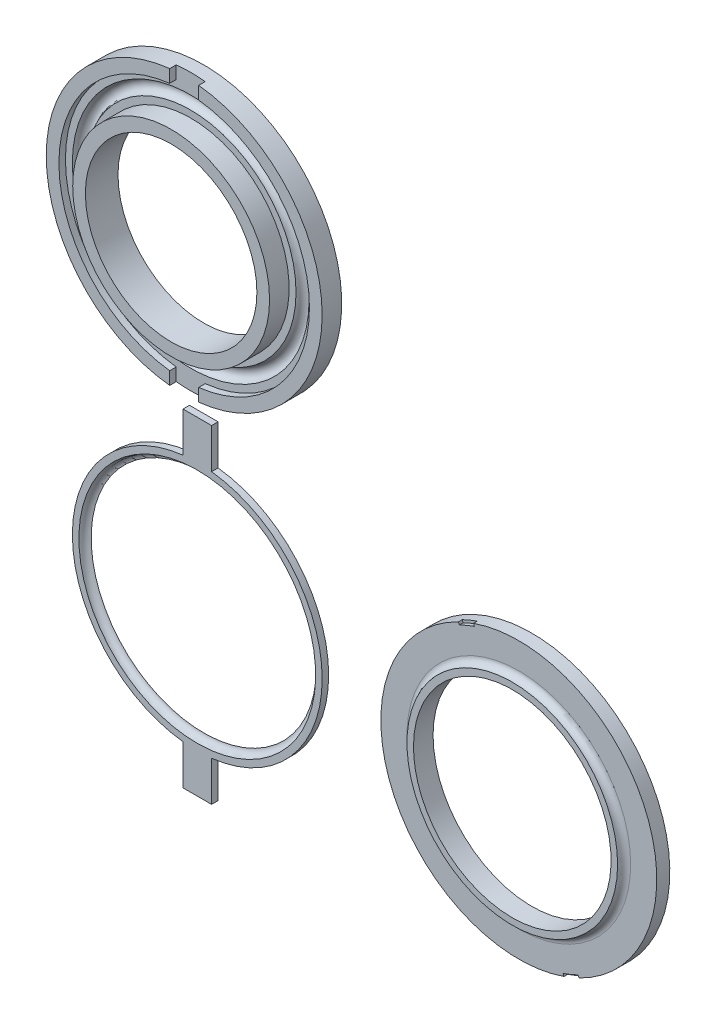
ISO-10303-21;
HEADER;
FILE_DESCRIPTION(('STEP AP214'),'2;1');
FILE_NAME('part.step','',(''),(''),'','','');
FILE_SCHEMA(('AUTOMOTIVE_DESIGN { 1 0 10303 214 1 1 1 1 }'));
ENDSEC;
DATA;
#1=APPLICATION_CONTEXT('core data for automotive mechanical design processes');
#2=APPLICATION_PROTOCOL_DEFINITION('international standard','automotive_design',2000,#1);
#3=PRODUCT_CONTEXT('',#1,'mechanical');
#4=PRODUCT('Part','Part','',(#3));
#5=PRODUCT_RELATED_PRODUCT_CATEGORY('part','',(#4));
#6=PRODUCT_DEFINITION_FORMATION('','',#4);
#7=PRODUCT_DEFINITION_CONTEXT('part definition',#1,'design');
#8=PRODUCT_DEFINITION('design','',#6,#7);
#9=PRODUCT_DEFINITION_SHAPE('','',#8);
#10=(LENGTH_UNIT() NAMED_UNIT(*) SI_UNIT(.MILLI.,.METRE.));
#11=(NAMED_UNIT(*) PLANE_ANGLE_UNIT() SI_UNIT($,.RADIAN.));
#12=(NAMED_UNIT(*) SI_UNIT($,.STERADIAN.) SOLID_ANGLE_UNIT());
#13=UNCERTAINTY_MEASURE_WITH_UNIT(LENGTH_MEASURE(1.E-05),#10,'distance_accuracy_value','');
#14=(GEOMETRIC_REPRESENTATION_CONTEXT(3) GLOBAL_UNCERTAINTY_ASSIGNED_CONTEXT((#13)) GLOBAL_UNIT_ASSIGNED_CONTEXT((#10,
#11,#12)) REPRESENTATION_CONTEXT('',''));
#15=CARTESIAN_POINT('',(0.,0.,0.));
#16=DIRECTION('',(0.,0.,1.));
#17=DIRECTION('',(1.,0.,0.));
#18=AXIS2_PLACEMENT_3D('',#15,#16,#17);
#19=CARTESIAN_POINT('',(88.,0.,-3.48853386507138));
#20=DIRECTION('',(0.,0.,1.));
#21=DIRECTION('',(0.923728021347068,0.383049008063238,0.));
#22=AXIS2_PLACEMENT_3D('',#19,#20,#21);
#23=CYLINDRICAL_SURFACE('',#22,37.);
#24=DIRECTION('',(0.,0.,1.));
#25=VECTOR('',#24,1.);
#26=CARTESIAN_POINT('',(100.112832389232,-34.9611111309463,-3.48853386507137));
#27=LINE('',#26,#25);
#28=CARTESIAN_POINT('',(100.112832389232,-34.9611111309463,1.76146613492862));
#29=VERTEX_POINT('',#28);
#30=CARTESIAN_POINT('',(100.112832389232,-34.9611111309463,0.761466134928622));
#31=VERTEX_POINT('',#30);
#32=EDGE_CURVE('E16',#29,#31,#27,.F.);
#33=ORIENTED_EDGE('',*,*,#32,.F.);
#34=CARTESIAN_POINT('',(88.,0.,1.76146613492862));
#35=DIRECTION('',(0.,0.,-1.));
#36=DIRECTION('',(-0.923728021347068,-0.383049008063238,0.));
#37=AXIS2_PLACEMENT_3D('',#34,#35,#36);
#38=CIRCLE('',#37,37.);
#39=CARTESIAN_POINT('',(71.8174875321879,33.2735073328483,1.76146613492862));
#40=VERTEX_POINT('',#39);
#41=EDGE_CURVE('E221',#29,#40,#38,.T.);
#42=ORIENTED_EDGE('',*,*,#41,.T.);
#43=DIRECTION('',(0.,0.,1.));
#44=VECTOR('',#43,1.);
#45=CARTESIAN_POINT('',(71.8174875321879,33.2735073328483,-3.48853386507137));
#46=LINE('',#45,#44);
#47=CARTESIAN_POINT('',(71.8174875321879,33.2735073328483,0.761466134928622));
#48=VERTEX_POINT('',#47);
#49=EDGE_CURVE('E189',#40,#48,#46,.F.);
#50=ORIENTED_EDGE('',*,*,#49,.T.);
#51=CARTESIAN_POINT('',(88.,0.,0.761466134928622));
#52=DIRECTION('',(0.,0.,-1.));
#53=DIRECTION('',(-0.923728021347068,-0.383049008063238,0.));
#54=AXIS2_PLACEMENT_3D('',#51,#52,#53);
#55=CIRCLE('',#54,37.);
#56=CARTESIAN_POINT('',(75.8406965293284,34.9449758779158,0.761466134928622));
#57=VERTEX_POINT('',#56);
#58=EDGE_CURVE('E186',#48,#57,#55,.T.);
#59=ORIENTED_EDGE('',*,*,#58,.T.);
#60=DIRECTION('',(0.,0.,1.));
#61=VECTOR('',#60,1.);
#62=CARTESIAN_POINT('',(75.8406965293284,34.9449758779158,-3.48853386507138));
#63=LINE('',#62,#61);
#64=CARTESIAN_POINT('',(75.8406965293284,34.9449758779158,1.76146613492862));
#65=VERTEX_POINT('',#64);
#66=EDGE_CURVE('E163',#57,#65,#63,.T.);
#67=ORIENTED_EDGE('',*,*,#66,.T.);
#68=CARTESIAN_POINT('',(104.138260095319,-33.2949930334253,1.76146613492862));
#69=VERTEX_POINT('',#68);
#70=EDGE_CURVE('E179',#65,#69,#38,.T.);
#71=ORIENTED_EDGE('',*,*,#70,.T.);
#72=DIRECTION('',(0.,0.,1.));
#73=VECTOR('',#72,1.);
#74=CARTESIAN_POINT('',(104.138260095319,-33.2949930334252,-3.48853386507138));
#75=LINE('',#74,#73);
#76=CARTESIAN_POINT('',(104.138260095319,-33.2949930334252,0.761466134928622));
#77=VERTEX_POINT('',#76);
#78=EDGE_CURVE('E105',#77,#69,#75,.T.);
#79=ORIENTED_EDGE('',*,*,#78,.F.);
#80=CARTESIAN_POINT('',(88.,0.,0.761466134928622));
#81=DIRECTION('',(0.,0.,1.));
#82=DIRECTION('',(0.923728021347068,0.383049008063238,0.));
#83=AXIS2_PLACEMENT_3D('',#80,#81,#82);
#84=CIRCLE('',#83,37.);
#85=EDGE_CURVE('E161',#31,#77,#84,.T.);
#86=ORIENTED_EDGE('',*,*,#85,.F.);
#87=EDGE_LOOP('',(#33,#42,#50,#59,#67,#71,#79,#86));
#88=FACE_BOUND('',#87,.T.);
#89=CARTESIAN_POINT('',(88.,0.,-1.73853386507138));
#90=DIRECTION('',(0.,0.,-1.));
#91=DIRECTION('',(-1.,0.,0.));
#92=AXIS2_PLACEMENT_3D('',#89,#90,#91);
#93=CIRCLE('',#92,37.);
#94=CARTESIAN_POINT('',(51.,0.,-1.73853386507138));
#95=VERTEX_POINT('',#94);
#96=EDGE_CURVE('E246',#95,#95,#93,.T.);
#97=ORIENTED_EDGE('',*,*,#96,.F.);
#98=EDGE_LOOP('',(#97));
#99=FACE_BOUND('',#98,.T.);
#100=ADVANCED_FACE('F95',(#88,#99),#23,.T.);
#101=CARTESIAN_POINT('',(88.,0.,0.011466134928624));
#102=DIRECTION('',(0.,0.,1.));
#103=DIRECTION('',(0.923728021347068,0.383049008063238,0.));
#104=AXIS2_PLACEMENT_3D('',#101,#102,#103);
#105=CYLINDRICAL_SURFACE('',#104,26.5);
#106=CARTESIAN_POINT('',(88.,0.,3.51146613492862));
#107=DIRECTION('',(0.,0.,-1.));
#108=DIRECTION('',(-0.923728021347068,-0.383049008063238,0.));
#109=AXIS2_PLACEMENT_3D('',#106,#107,#108);
#110=CIRCLE('',#109,26.5);
#111=CARTESIAN_POINT('',(63.5212074343027,-10.1507987136758,3.51146613492862));
#112=VERTEX_POINT('',#111);
#113=EDGE_CURVE('E213',#112,#112,#110,.T.);
#114=ORIENTED_EDGE('',*,*,#113,.F.);
#115=EDGE_LOOP('',(#114));
#116=FACE_BOUND('',#115,.T.);
#117=CARTESIAN_POINT('',(88.,0.,-1.73853386507138));
#118=DIRECTION('',(0.,0.,-1.));
#119=DIRECTION('',(-1.,0.,0.));
#120=AXIS2_PLACEMENT_3D('',#117,#118,#119);
#121=CIRCLE('',#120,26.5);
#122=CARTESIAN_POINT('',(61.5,0.,-1.73853386507138));
#123=VERTEX_POINT('',#122);
#124=EDGE_CURVE('E99',#123,#123,#121,.T.);
#125=ORIENTED_EDGE('',*,*,#124,.T.);
#126=EDGE_LOOP('',(#125));
#127=FACE_BOUND('',#126,.T.);
#128=ADVANCED_FACE('F253',(#116,#127),#105,.F.);
#129=CARTESIAN_POINT('',(88.,0.,3.51146613492862));
#130=DIRECTION('',(0.,0.,-1.));
#131=DIRECTION('',(-0.923728021347068,-0.383049008063238,0.));
#132=AXIS2_PLACEMENT_3D('',#129,#130,#131);
#133=TOROIDAL_SURFACE('',#132,30.,1.75);
#134=CARTESIAN_POINT('',(60.288159359588,-11.4914702418971,3.51146613492862));
#135=DIRECTION('',(-0.383049008063238,0.923728021347068,0.));
#136=DIRECTION('',(0.923728021347068,0.383049008063238,0.));
#137=AXIS2_PLACEMENT_3D('',#134,#135,#136);
#138=CIRCLE('',#137,1.75);
#139=CARTESIAN_POINT('',(61.9046833969453,-10.8211344777865,3.51146613492862));
#140=VERTEX_POINT('',#139);
#141=CARTESIAN_POINT('',(60.288159359588,-11.4914702418971,1.76146613492862));
#142=VERTEX_POINT('',#141);
#143=EDGE_CURVE('E208',#140,#142,#138,.T.);
#144=ORIENTED_EDGE('',*,*,#143,.T.);
#145=CARTESIAN_POINT('',(88.,0.,1.76146613492862));
#146=DIRECTION('',(0.,0.,-1.));
#147=DIRECTION('',(-0.923728021347068,-0.383049008063238,0.));
#148=AXIS2_PLACEMENT_3D('',#145,#146,#147);
#149=CIRCLE('',#148,30.);
#150=EDGE_CURVE('E195',#142,#142,#149,.F.);
#151=ORIENTED_EDGE('',*,*,#150,.T.);
#152=ORIENTED_EDGE('',*,*,#143,.F.);
#153=CARTESIAN_POINT('',(88.,0.,3.51146613492862));
#154=DIRECTION('',(0.,0.,1.));
#155=DIRECTION('',(0.923728021347068,0.383049008063238,0.));
#156=AXIS2_PLACEMENT_3D('',#153,#154,#155);
#157=CIRCLE('',#156,28.25);
#158=EDGE_CURVE('E216',#140,#140,#157,.T.);
#159=ORIENTED_EDGE('',*,*,#158,.F.);
#160=EDGE_LOOP('',(#144,#151,#152,#159));
#161=FACE_BOUND('',#160,.T.);
#162=ADVANCED_FACE('F268',(#161),#133,.F.);
#163=CARTESIAN_POINT('',(88.,0.,3.51146613492862));
#164=DIRECTION('',(0.,0.,-1.));
#165=DIRECTION('',(-0.923728021347068,-0.383049008063238,0.));
#166=AXIS2_PLACEMENT_3D('',#163,#164,#165);
#167=PLANE('',#166);
#168=ORIENTED_EDGE('',*,*,#113,.T.);
#169=EDGE_LOOP('',(#168));
#170=FACE_BOUND('',#169,.T.);
#171=ORIENTED_EDGE('',*,*,#158,.T.);
#172=EDGE_LOOP('',(#171));
#173=FACE_BOUND('',#172,.T.);
#174=ADVANCED_FACE('F275',(#170,#173),#167,.F.);
#175=CARTESIAN_POINT('',(105.330974134264,-36.1712395607262,0.011466134928624));
#176=DIRECTION('',(0.923728021347068,0.383049008063238,0.));
#177=DIRECTION('',(0.,0.,-1.));
#178=AXIS2_PLACEMENT_3D('',#175,#176,#177);
#179=PLANE('',#178);
#180=DIRECTION('',(-0.383049008063238,0.923728021347068,0.));
#181=VECTOR('',#180,1.);
#182=CARTESIAN_POINT('',(105.330974134264,-36.1712395607262,0.761466134928622));
#183=LINE('',#182,#181);
#184=CARTESIAN_POINT('',(76.0901088586741,34.3435145697375,0.761466134928622));
#185=VERTEX_POINT('',#184);
#186=EDGE_CURVE('E190',#185,#57,#183,.T.);
#187=ORIENTED_EDGE('',*,*,#186,.F.);
#188=DIRECTION('',(0.,0.,1.));
#189=VECTOR('',#188,1.);
#190=CARTESIAN_POINT('',(76.0901088586741,34.3435145697375,-3.48853386507138));
#191=LINE('',#190,#189);
#192=CARTESIAN_POINT('',(76.0901088586741,34.3435145697375,1.76146613492862));
#193=VERTEX_POINT('',#192);
#194=EDGE_CURVE('E192',#193,#185,#191,.F.);
#195=ORIENTED_EDGE('',*,*,#194,.F.);
#196=DIRECTION('',(-0.383049008063238,0.923728021347068,0.));
#197=VECTOR('',#196,1.);
#198=CARTESIAN_POINT('',(105.330974134264,-36.1712395607262,1.76146613492862));
#199=LINE('',#198,#197);
#200=EDGE_CURVE('E234',#193,#65,#199,.T.);
#201=ORIENTED_EDGE('',*,*,#200,.T.);
#202=ORIENTED_EDGE('',*,*,#66,.F.);
#203=EDGE_LOOP('',(#187,#195,#201,#202));
#204=FACE_BOUND('',#203,.T.);
#205=ADVANCED_FACE('F279',(#204),#179,.F.);
#206=CARTESIAN_POINT('',(105.330974134264,-36.1712395607262,0.761466134928622));
#207=DIRECTION('',(0.,0.,-1.));
#208=DIRECTION('',(-0.923728021347068,-0.383049008063238,0.));
#209=AXIS2_PLACEMENT_3D('',#206,#207,#208);
#210=PLANE('',#209);
#211=DIRECTION('',(-0.383049008063238,0.923728021347068,0.));
#212=VECTOR('',#211,1.);
#213=CARTESIAN_POINT('',(101.306655782651,-37.8400328820205,0.761466134928622));
#214=LINE('',#213,#212);
#215=CARTESIAN_POINT('',(72.0669197695567,32.6719980161951,0.761466134928622));
#216=VERTEX_POINT('',#215);
#217=EDGE_CURVE('E184',#216,#48,#214,.T.);
#218=ORIENTED_EDGE('',*,*,#217,.F.);
#219=CARTESIAN_POINT('',(88.,0.,0.761466134928622));
#220=DIRECTION('',(0.,0.,-1.));
#221=DIRECTION('',(-0.923728021347068,-0.383049008063238,0.));
#222=AXIS2_PLACEMENT_3D('',#219,#220,#221);
#223=CIRCLE('',#222,36.35);
#224=EDGE_CURVE('E154',#185,#216,#223,.F.);
#225=ORIENTED_EDGE('',*,*,#224,.F.);
#226=ORIENTED_EDGE('',*,*,#186,.T.);
#227=ORIENTED_EDGE('',*,*,#58,.F.);
#228=EDGE_LOOP('',(#218,#225,#226,#227));
#229=FACE_BOUND('',#228,.T.);
#230=ADVANCED_FACE('F281',(#229),#210,.F.);
#231=CARTESIAN_POINT('',(101.306655782651,-37.8400328820205,0.011466134928624));
#232=DIRECTION('',(-0.923728021347068,-0.383049008063238,0.));
#233=DIRECTION('',(0.,0.,1.));
#234=AXIS2_PLACEMENT_3D('',#231,#232,#233);
#235=PLANE('',#234);
#236=ORIENTED_EDGE('',*,*,#49,.F.);
#237=DIRECTION('',(-0.383049008063238,0.923728021347068,0.));
#238=VECTOR('',#237,1.);
#239=CARTESIAN_POINT('',(101.306655782651,-37.8400328820205,1.76146613492862));
#240=LINE('',#239,#238);
#241=CARTESIAN_POINT('',(72.0669197695567,32.6719980161951,1.76146613492862));
#242=VERTEX_POINT('',#241);
#243=EDGE_CURVE('E224',#242,#40,#240,.T.);
#244=ORIENTED_EDGE('',*,*,#243,.F.);
#245=DIRECTION('',(0.,0.,1.));
#246=VECTOR('',#245,1.);
#247=CARTESIAN_POINT('',(72.0669197695567,32.6719980161951,-3.48853386507137));
#248=LINE('',#247,#246);
#249=EDGE_CURVE('E160',#216,#242,#248,.T.);
#250=ORIENTED_EDGE('',*,*,#249,.F.);
#251=ORIENTED_EDGE('',*,*,#217,.T.);
#252=EDGE_LOOP('',(#236,#244,#250,#251));
#253=FACE_BOUND('',#252,.T.);
#254=ADVANCED_FACE('F223',(#253),#235,.F.);
#255=CARTESIAN_POINT('',(88.,0.,-3.48853386507138));
#256=DIRECTION('',(0.,0.,1.));
#257=DIRECTION('',(0.923728021347068,0.383049008063238,0.));
#258=AXIS2_PLACEMENT_3D('',#255,#256,#257);
#259=CYLINDRICAL_SURFACE('',#258,36.35);
#260=ORIENTED_EDGE('',*,*,#249,.T.);
#261=CARTESIAN_POINT('',(88.,0.,1.76146613492862));
#262=DIRECTION('',(0.,0.,1.));
#263=DIRECTION('',(0.923728021347068,0.383049008063238,0.));
#264=AXIS2_PLACEMENT_3D('',#261,#262,#263);
#265=CIRCLE('',#264,36.35);
#266=EDGE_CURVE('E232',#242,#193,#265,.F.);
#267=ORIENTED_EDGE('',*,*,#266,.T.);
#268=ORIENTED_EDGE('',*,*,#194,.T.);
#269=ORIENTED_EDGE('',*,*,#224,.T.);
#270=EDGE_LOOP('',(#260,#267,#268,#269));
#271=FACE_BOUND('',#270,.T.);
#272=ADVANCED_FACE('F287',(#271),#259,.T.);
#273=CARTESIAN_POINT('',(71.2939999028797,34.5359050465652,0.011466134928624));
#274=DIRECTION('',(0.923728021347068,0.383049008063238,0.));
#275=DIRECTION('',(0.,0.,-1.));
#276=AXIS2_PLACEMENT_3D('',#273,#274,#275);
#277=PLANE('',#276);
#278=ORIENTED_EDGE('',*,*,#32,.T.);
#279=DIRECTION('',(0.383049008063238,-0.923728021347068,0.));
#280=VECTOR('',#279,1.);
#281=CARTESIAN_POINT('',(71.2939999028797,34.5359050465652,0.761466134928622));
#282=LINE('',#281,#280);
#283=CARTESIAN_POINT('',(99.863400151863,-34.3596018142931,0.761466134928622));
#284=VERTEX_POINT('',#283);
#285=EDGE_CURVE('E114',#284,#31,#282,.T.);
#286=ORIENTED_EDGE('',*,*,#285,.F.);
#287=DIRECTION('',(0.,0.,1.));
#288=VECTOR('',#287,1.);
#289=CARTESIAN_POINT('',(99.863400151863,-34.3596018142931,-3.48853386507137));
#290=LINE('',#289,#288);
#291=CARTESIAN_POINT('',(99.863400151863,-34.3596018142931,1.76146613492862));
#292=VERTEX_POINT('',#291);
#293=EDGE_CURVE('E196',#284,#292,#290,.T.);
#294=ORIENTED_EDGE('',*,*,#293,.T.);
#295=DIRECTION('',(0.383049008063238,-0.923728021347068,0.));
#296=VECTOR('',#295,1.);
#297=CARTESIAN_POINT('',(71.2939999028797,34.5359050465652,1.76146613492862));
#298=LINE('',#297,#296);
#299=EDGE_CURVE('E244',#292,#29,#298,.T.);
#300=ORIENTED_EDGE('',*,*,#299,.T.);
#301=EDGE_LOOP('',(#278,#286,#294,#300));
#302=FACE_BOUND('',#301,.T.);
#303=ADVANCED_FACE('F301',(#302),#277,.T.);
#304=CARTESIAN_POINT('',(75.3183182544936,36.2046983678594,0.011466134928624));
#305=DIRECTION('',(-0.923728021347068,-0.383049008063238,0.));
#306=DIRECTION('',(0.,0.,1.));
#307=AXIS2_PLACEMENT_3D('',#304,#305,#306);
#308=PLANE('',#307);
#309=ORIENTED_EDGE('',*,*,#78,.T.);
#310=DIRECTION('',(0.383049008063238,-0.923728021347068,0.));
#311=VECTOR('',#310,1.);
#312=CARTESIAN_POINT('',(75.3183182544936,36.2046983678594,1.76146613492862));
#313=LINE('',#312,#311);
#314=CARTESIAN_POINT('',(103.888847765973,-32.6935317252469,1.76146613492862));
#315=VERTEX_POINT('',#314);
#316=EDGE_CURVE('E239',#315,#69,#313,.T.);
#317=ORIENTED_EDGE('',*,*,#316,.F.);
#318=DIRECTION('',(0.,0.,1.));
#319=VECTOR('',#318,1.);
#320=CARTESIAN_POINT('',(103.888847765973,-32.6935317252469,-3.48853386507138));
#321=LINE('',#320,#319);
#322=CARTESIAN_POINT('',(103.888847765973,-32.6935317252469,0.761466134928622));
#323=VERTEX_POINT('',#322);
#324=EDGE_CURVE('E173',#315,#323,#321,.F.);
#325=ORIENTED_EDGE('',*,*,#324,.T.);
#326=DIRECTION('',(0.383049008063238,-0.923728021347068,0.));
#327=VECTOR('',#326,1.);
#328=CARTESIAN_POINT('',(75.3183182544936,36.2046983678594,0.761466134928622));
#329=LINE('',#328,#327);
#330=EDGE_CURVE('E127',#323,#77,#329,.T.);
#331=ORIENTED_EDGE('',*,*,#330,.T.);
#332=EDGE_LOOP('',(#309,#317,#325,#331));
#333=FACE_BOUND('',#332,.T.);
#334=ADVANCED_FACE('F168',(#333),#308,.T.);
#335=CARTESIAN_POINT('',(75.3183182544936,36.2046983678594,0.761466134928622));
#336=DIRECTION('',(0.,0.,1.));
#337=DIRECTION('',(0.923728021347068,0.383049008063238,0.));
#338=AXIS2_PLACEMENT_3D('',#335,#336,#337);
#339=PLANE('',#338);
#340=ORIENTED_EDGE('',*,*,#85,.T.);
#341=ORIENTED_EDGE('',*,*,#330,.F.);
#342=CARTESIAN_POINT('',(88.,0.,0.761466134928622));
#343=DIRECTION('',(0.,0.,1.));
#344=DIRECTION('',(0.923728021347068,0.383049008063238,0.));
#345=AXIS2_PLACEMENT_3D('',#342,#343,#344);
#346=CIRCLE('',#345,36.35);
#347=EDGE_CURVE('E174',#323,#284,#346,.F.);
#348=ORIENTED_EDGE('',*,*,#347,.T.);
#349=ORIENTED_EDGE('',*,*,#285,.T.);
#350=EDGE_LOOP('',(#340,#341,#348,#349));
#351=FACE_BOUND('',#350,.T.);
#352=ADVANCED_FACE('F97',(#351),#339,.T.);
#353=CARTESIAN_POINT('',(88.,0.,-3.48853386507138));
#354=DIRECTION('',(0.,0.,1.));
#355=DIRECTION('',(0.923728021347068,0.383049008063238,0.));
#356=AXIS2_PLACEMENT_3D('',#353,#354,#355);
#357=CYLINDRICAL_SURFACE('',#356,36.35);
#358=ORIENTED_EDGE('',*,*,#347,.F.);
#359=ORIENTED_EDGE('',*,*,#324,.F.);
#360=CARTESIAN_POINT('',(88.,0.,1.76146613492862));
#361=DIRECTION('',(0.,0.,-1.));
#362=DIRECTION('',(-0.923728021347068,-0.383049008063238,0.));
#363=AXIS2_PLACEMENT_3D('',#360,#361,#362);
#364=CIRCLE('',#363,36.35);
#365=EDGE_CURVE('E241',#292,#315,#364,.F.);
#366=ORIENTED_EDGE('',*,*,#365,.F.);
#367=ORIENTED_EDGE('',*,*,#293,.F.);
#368=EDGE_LOOP('',(#358,#359,#366,#367));
#369=FACE_BOUND('',#368,.T.);
#370=ADVANCED_FACE('F261',(#369),#357,.T.);
#371=CARTESIAN_POINT('',(88.,0.,1.76146613492862));
#372=DIRECTION('',(0.,0.,-1.));
#373=DIRECTION('',(-0.923728021347068,-0.383049008063238,0.));
#374=AXIS2_PLACEMENT_3D('',#371,#372,#373);
#375=PLANE('',#374);
#376=ORIENTED_EDGE('',*,*,#299,.F.);
#377=ORIENTED_EDGE('',*,*,#365,.T.);
#378=ORIENTED_EDGE('',*,*,#316,.T.);
#379=ORIENTED_EDGE('',*,*,#70,.F.);
#380=ORIENTED_EDGE('',*,*,#200,.F.);
#381=ORIENTED_EDGE('',*,*,#266,.F.);
#382=ORIENTED_EDGE('',*,*,#243,.T.);
#383=ORIENTED_EDGE('',*,*,#41,.F.);
#384=EDGE_LOOP('',(#376,#377,#378,#379,#380,#381,#382,#383));
#385=FACE_BOUND('',#384,.T.);
#386=ORIENTED_EDGE('',*,*,#150,.F.);
#387=EDGE_LOOP('',(#386));
#388=FACE_BOUND('',#387,.T.);
#389=ADVANCED_FACE('F228',(#385,#388),#375,.F.);
#390=CARTESIAN_POINT('',(88.,0.,-1.73853386507138));
#391=DIRECTION('',(0.,0.,-1.));
#392=DIRECTION('',(-1.,0.,0.));
#393=AXIS2_PLACEMENT_3D('',#390,#391,#392);
#394=PLANE('',#393);
#395=ORIENTED_EDGE('',*,*,#124,.F.);
#396=EDGE_LOOP('',(#395));
#397=FACE_BOUND('',#396,.T.);
#398=ORIENTED_EDGE('',*,*,#96,.T.);
#399=EDGE_LOOP('',(#398));
#400=FACE_BOUND('',#399,.T.);
#401=ADVANCED_FACE('F255',(#397,#400),#394,.T.);
#402=CLOSED_SHELL('',(#100,#128,#162,#174,#205,#230,#254,#272,#303,#334,#352,#370,#389,#401));
#403=MANIFOLD_SOLID_BREP('B2',#402);
#404=CARTESIAN_POINT('',(0.,88.,3.51146613492862));
#405=DIRECTION('',(0.,0.,-1.));
#406=DIRECTION('',(-1.,0.,0.));
#407=AXIS2_PLACEMENT_3D('',#404,#405,#406);
#408=CYLINDRICAL_SURFACE('',#407,33.6);
#409=CARTESIAN_POINT('',(0.,88.,3.51146613492862));
#410=DIRECTION('',(0.,0.,1.));
#411=DIRECTION('',(1.,0.,0.));
#412=AXIS2_PLACEMENT_3D('',#409,#410,#411);
#413=CIRCLE('',#412,33.6);
#414=CARTESIAN_POINT('',(-3.885,121.374642694717,3.51146613492862));
#415=VERTEX_POINT('',#414);
#416=CARTESIAN_POINT('',(-3.885,54.6253573052834,3.51146613492862));
#417=VERTEX_POINT('',#416);
#418=EDGE_CURVE('E799',#415,#417,#413,.T.);
#419=ORIENTED_EDGE('',*,*,#418,.T.);
#420=DIRECTION('',(0.,0.,1.));
#421=VECTOR('',#420,1.);
#422=CARTESIAN_POINT('',(-3.885,54.6253573052834,-6.81268779365067));
#423=LINE('',#422,#421);
#424=CARTESIAN_POINT('',(-3.885,54.6253573052834,1.76146613492862));
#425=VERTEX_POINT('',#424);
#426=EDGE_CURVE('E458',#425,#417,#423,.T.);
#427=ORIENTED_EDGE('',*,*,#426,.F.);
#428=CARTESIAN_POINT('',(0.,88.,1.76146613492862));
#429=DIRECTION('',(0.,0.,1.));
#430=DIRECTION('',(1.,0.,0.));
#431=AXIS2_PLACEMENT_3D('',#428,#429,#430);
#432=CIRCLE('',#431,33.6);
#433=CARTESIAN_POINT('',(-3.885,121.374642694717,1.76146613492862));
#434=VERTEX_POINT('',#433);
#435=EDGE_CURVE('E534',#434,#425,#432,.T.);
#436=ORIENTED_EDGE('',*,*,#435,.F.);
#437=DIRECTION('',(0.,0.,1.));
#438=VECTOR('',#437,1.);
#439=CARTESIAN_POINT('',(-3.885,121.374642694717,-6.81268779365067));
#440=LINE('',#439,#438);
#441=EDGE_CURVE('E818',#434,#415,#440,.T.);
#442=ORIENTED_EDGE('',*,*,#441,.T.);
#443=EDGE_LOOP('',(#419,#427,#436,#442));
#444=FACE_BOUND('',#443,.T.);
#445=ADVANCED_FACE('F434',(#444),#408,.F.);
#446=CARTESIAN_POINT('',(0.,88.,3.51146613492862));
#447=DIRECTION('',(0.,0.,1.));
#448=DIRECTION('',(1.,0.,0.));
#449=AXIS2_PLACEMENT_3D('',#446,#447,#448);
#450=PLANE('',#449);
#451=CARTESIAN_POINT('',(0.,88.,3.51146613492862));
#452=DIRECTION('',(0.,0.,1.));
#453=DIRECTION('',(1.,0.,0.));
#454=AXIS2_PLACEMENT_3D('',#451,#452,#453);
#455=CIRCLE('',#454,37.);
#456=CARTESIAN_POINT('',(-3.885,124.795472207868,3.51146613492862));
#457=VERTEX_POINT('',#456);
#458=CARTESIAN_POINT('',(-3.885,51.2045277921318,3.51146613492862));
#459=VERTEX_POINT('',#458);
#460=EDGE_CURVE('E551',#457,#459,#455,.T.);
#461=ORIENTED_EDGE('',*,*,#460,.T.);
#462=DIRECTION('',(0.,1.,0.));
#463=VECTOR('',#462,1.);
#464=CARTESIAN_POINT('',(-3.885,0.,3.51146613492862));
#465=LINE('',#464,#463);
#466=EDGE_CURVE('E837',#459,#417,#465,.T.);
#467=ORIENTED_EDGE('',*,*,#466,.T.);
#468=ORIENTED_EDGE('',*,*,#418,.F.);
#469=DIRECTION('',(0.,1.,0.));
#470=VECTOR('',#469,1.);
#471=CARTESIAN_POINT('',(-3.885,0.,3.51146613492862));
#472=LINE('',#471,#470);
#473=EDGE_CURVE('E821',#415,#457,#472,.T.);
#474=ORIENTED_EDGE('',*,*,#473,.T.);
#475=EDGE_LOOP('',(#461,#467,#468,#474));
#476=FACE_BOUND('',#475,.T.);
#477=ADVANCED_FACE('F590',(#476),#450,.T.);
#478=CARTESIAN_POINT('',(0.,88.,3.51146613492862));
#479=DIRECTION('',(0.,0.,-1.));
#480=DIRECTION('',(-1.,0.,0.));
#481=AXIS2_PLACEMENT_3D('',#478,#479,#480);
#482=CYLINDRICAL_SURFACE('',#481,23.);
#483=CARTESIAN_POINT('',(0.,88.,7.01146613492863));
#484=DIRECTION('',(0.,0.,1.));
#485=DIRECTION('',(1.,0.,0.));
#486=AXIS2_PLACEMENT_3D('',#483,#484,#485);
#487=CIRCLE('',#486,23.);
#488=CARTESIAN_POINT('',(23.,88.,7.01146613492863));
#489=VERTEX_POINT('',#488);
#490=EDGE_CURVE('E443',#489,#489,#487,.T.);
#491=ORIENTED_EDGE('',*,*,#490,.T.);
#492=EDGE_LOOP('',(#491));
#493=FACE_BOUND('',#492,.T.);
#494=CARTESIAN_POINT('',(0.,88.,-1.73853386507138));
#495=DIRECTION('',(0.,0.,-1.));
#496=DIRECTION('',(-1.,0.,0.));
#497=AXIS2_PLACEMENT_3D('',#494,#495,#496);
#498=CIRCLE('',#497,23.);
#499=CARTESIAN_POINT('',(-23.,88.,-1.73853386507138));
#500=VERTEX_POINT('',#499);
#501=EDGE_CURVE('E562',#500,#500,#498,.T.);
#502=ORIENTED_EDGE('',*,*,#501,.T.);
#503=EDGE_LOOP('',(#502));
#504=FACE_BOUND('',#503,.T.);
#505=ADVANCED_FACE('F436',(#493,#504),#482,.F.);
#506=CARTESIAN_POINT('',(0.,88.,3.51146613492862));
#507=DIRECTION('',(0.,0.,-1.));
#508=DIRECTION('',(-1.,0.,0.));
#509=AXIS2_PLACEMENT_3D('',#506,#507,#508);
#510=CYLINDRICAL_SURFACE('',#509,26.4);
#511=CARTESIAN_POINT('',(0.,88.,1.76146613492862));
#512=DIRECTION('',(0.,0.,-1.));
#513=DIRECTION('',(-1.,0.,0.));
#514=AXIS2_PLACEMENT_3D('',#511,#512,#513);
#515=CIRCLE('',#514,26.4);
#516=CARTESIAN_POINT('',(-26.4,88.,1.76146613492862));
#517=VERTEX_POINT('',#516);
#518=EDGE_CURVE('E566',#517,#517,#515,.T.);
#519=ORIENTED_EDGE('',*,*,#518,.F.);
#520=EDGE_LOOP('',(#519));
#521=FACE_BOUND('',#520,.T.);
#522=CARTESIAN_POINT('',(0.,88.,7.01146613492863));
#523=DIRECTION('',(0.,0.,1.));
#524=DIRECTION('',(1.,0.,0.));
#525=AXIS2_PLACEMENT_3D('',#522,#523,#524);
#526=CIRCLE('',#525,26.4);
#527=CARTESIAN_POINT('',(26.4,88.,7.01146613492863));
#528=VERTEX_POINT('',#527);
#529=EDGE_CURVE('E93',#528,#528,#526,.T.);
#530=ORIENTED_EDGE('',*,*,#529,.F.);
#531=EDGE_LOOP('',(#530));
#532=FACE_BOUND('',#531,.T.);
#533=ADVANCED_FACE('F578',(#521,#532),#510,.T.);
#534=CARTESIAN_POINT('',(0.,88.,7.01146613492863));
#535=DIRECTION('',(0.,0.,1.));
#536=DIRECTION('',(1.,0.,0.));
#537=AXIS2_PLACEMENT_3D('',#534,#535,#536);
#538=PLANE('',#537);
#539=ORIENTED_EDGE('',*,*,#529,.T.);
#540=EDGE_LOOP('',(#539));
#541=FACE_BOUND('',#540,.T.);
#542=ORIENTED_EDGE('',*,*,#490,.F.);
#543=EDGE_LOOP('',(#542));
#544=FACE_BOUND('',#543,.T.);
#545=ADVANCED_FACE('F575',(#541,#544),#538,.T.);
#546=CARTESIAN_POINT('',(0.,88.,-1.73853386507138));
#547=DIRECTION('',(0.,0.,-1.));
#548=DIRECTION('',(-1.,0.,0.));
#549=AXIS2_PLACEMENT_3D('',#546,#547,#548);
#550=PLANE('',#549);
#551=ORIENTED_EDGE('',*,*,#501,.F.);
#552=EDGE_LOOP('',(#551));
#553=FACE_BOUND('',#552,.T.);
#554=CARTESIAN_POINT('',(0.,88.,-1.73853386507138));
#555=DIRECTION('',(0.,0.,-1.));
#556=DIRECTION('',(-1.,0.,0.));
#557=AXIS2_PLACEMENT_3D('',#554,#555,#556);
#558=CIRCLE('',#557,37.);
#559=CARTESIAN_POINT('',(-37.,88.,-1.73853386507138));
#560=VERTEX_POINT('',#559);
#561=EDGE_CURVE('E546',#560,#560,#558,.T.);
#562=ORIENTED_EDGE('',*,*,#561,.T.);
#563=EDGE_LOOP('',(#562));
#564=FACE_BOUND('',#563,.T.);
#565=ADVANCED_FACE('F577',(#553,#564),#550,.T.);
#566=CARTESIAN_POINT('',(0.,88.,1.76146613492862));
#567=DIRECTION('',(0.,0.,-1.));
#568=DIRECTION('',(-1.,0.,0.));
#569=AXIS2_PLACEMENT_3D('',#566,#567,#568);
#570=PLANE('',#569);
#571=ORIENTED_EDGE('',*,*,#518,.T.);
#572=EDGE_LOOP('',(#571));
#573=FACE_BOUND('',#572,.T.);
#574=CARTESIAN_POINT('',(0.,88.,1.76146613492862));
#575=DIRECTION('',(0.,0.,1.));
#576=DIRECTION('',(1.,0.,0.));
#577=AXIS2_PLACEMENT_3D('',#574,#575,#576);
#578=CIRCLE('',#577,28.25);
#579=CARTESIAN_POINT('',(28.25,88.,1.76146613492862));
#580=VERTEX_POINT('',#579);
#581=EDGE_CURVE('E554',#580,#580,#578,.T.);
#582=ORIENTED_EDGE('',*,*,#581,.T.);
#583=EDGE_LOOP('',(#582));
#584=FACE_BOUND('',#583,.T.);
#585=ADVANCED_FACE('F585',(#573,#584),#570,.F.);
#586=CARTESIAN_POINT('',(3.885,54.6253573052834,1.76146613492862));
#587=VERTEX_POINT('',#586);
#588=CARTESIAN_POINT('',(3.885,121.374642694717,1.76146613492862));
#589=VERTEX_POINT('',#588);
#590=EDGE_CURVE('E523',#587,#589,#432,.T.);
#591=ORIENTED_EDGE('',*,*,#590,.T.);
#592=DIRECTION('',(0.,1.,0.));
#593=VECTOR('',#592,1.);
#594=CARTESIAN_POINT('',(3.885,0.,1.76146613492862));
#595=LINE('',#594,#593);
#596=CARTESIAN_POINT('',(3.885,124.795472207868,1.76146613492862));
#597=VERTEX_POINT('',#596);
#598=EDGE_CURVE('E811',#589,#597,#595,.T.);
#599=ORIENTED_EDGE('',*,*,#598,.T.);
#600=CARTESIAN_POINT('',(0.,88.,1.76146613492862));
#601=DIRECTION('',(0.,0.,-1.));
#602=DIRECTION('',(-1.,0.,0.));
#603=AXIS2_PLACEMENT_3D('',#600,#601,#602);
#604=CIRCLE('',#603,37.);
#605=CARTESIAN_POINT('',(-3.885,124.795472207868,1.76146613492862));
#606=VERTEX_POINT('',#605);
#607=EDGE_CURVE('E806',#597,#606,#604,.F.);
#608=ORIENTED_EDGE('',*,*,#607,.T.);
#609=DIRECTION('',(0.,1.,0.));
#610=VECTOR('',#609,1.);
#611=CARTESIAN_POINT('',(-3.885,0.,1.76146613492862));
#612=LINE('',#611,#610);
#613=EDGE_CURVE('E804',#434,#606,#612,.T.);
#614=ORIENTED_EDGE('',*,*,#613,.F.);
#615=ORIENTED_EDGE('',*,*,#435,.T.);
#616=DIRECTION('',(0.,1.,0.));
#617=VECTOR('',#616,1.);
#618=CARTESIAN_POINT('',(-3.885,0.,1.76146613492862));
#619=LINE('',#618,#617);
#620=CARTESIAN_POINT('',(-3.885,51.2045277921318,1.76146613492862));
#621=VERTEX_POINT('',#620);
#622=EDGE_CURVE('E791',#621,#425,#619,.T.);
#623=ORIENTED_EDGE('',*,*,#622,.F.);
#624=CARTESIAN_POINT('',(0.,88.,1.76146613492862));
#625=DIRECTION('',(0.,0.,-1.));
#626=DIRECTION('',(-1.,0.,0.));
#627=AXIS2_PLACEMENT_3D('',#624,#625,#626);
#628=CIRCLE('',#627,37.);
#629=CARTESIAN_POINT('',(3.885,51.2045277921318,1.76146613492862));
#630=VERTEX_POINT('',#629);
#631=EDGE_CURVE('E526',#621,#630,#628,.F.);
#632=ORIENTED_EDGE('',*,*,#631,.T.);
#633=DIRECTION('',(0.,1.,0.));
#634=VECTOR('',#633,1.);
#635=CARTESIAN_POINT('',(3.885,0.,1.76146613492862));
#636=LINE('',#635,#634);
#637=EDGE_CURVE('E508',#630,#587,#636,.T.);
#638=ORIENTED_EDGE('',*,*,#637,.T.);
#639=EDGE_LOOP('',(#591,#599,#608,#614,#615,#623,#632,#638));
#640=FACE_BOUND('',#639,.T.);
#641=CARTESIAN_POINT('',(0.,88.,1.76146613492862));
#642=DIRECTION('',(0.,0.,-1.));
#643=DIRECTION('',(-1.,0.,0.));
#644=AXIS2_PLACEMENT_3D('',#641,#642,#643);
#645=CIRCLE('',#644,31.75);
#646=CARTESIAN_POINT('',(31.75,88.,1.76146613492862));
#647=VERTEX_POINT('',#646);
#648=EDGE_CURVE('E558',#647,#647,#645,.T.);
#649=ORIENTED_EDGE('',*,*,#648,.T.);
#650=EDGE_LOOP('',(#649));
#651=FACE_BOUND('',#650,.T.);
#652=ADVANCED_FACE('F520',(#640,#651),#570,.F.);
#653=CARTESIAN_POINT('',(0.,88.,1.76146613492862));
#654=DIRECTION('',(0.,0.,1.));
#655=DIRECTION('',(1.,0.,0.));
#656=AXIS2_PLACEMENT_3D('',#653,#654,#655);
#657=TOROIDAL_SURFACE('',#656,30.,1.75);
#658=CARTESIAN_POINT('',(30.,88.,1.76146613492862));
#659=DIRECTION('',(0.,1.,0.));
#660=DIRECTION('',(-1.,0.,0.));
#661=AXIS2_PLACEMENT_3D('',#658,#659,#660);
#662=CIRCLE('',#661,1.75);
#663=EDGE_CURVE('E550',#647,#580,#662,.T.);
#664=ORIENTED_EDGE('',*,*,#663,.T.);
#665=ORIENTED_EDGE('',*,*,#581,.F.);
#666=ORIENTED_EDGE('',*,*,#663,.F.);
#667=ORIENTED_EDGE('',*,*,#648,.F.);
#668=EDGE_LOOP('',(#664,#665,#666,#667));
#669=FACE_BOUND('',#668,.T.);
#670=ADVANCED_FACE('F609',(#669),#657,.F.);
#671=CARTESIAN_POINT('',(0.,88.,106.413269750538));
#672=DIRECTION('',(0.,0.,-1.));
#673=DIRECTION('',(-1.,0.,0.));
#674=AXIS2_PLACEMENT_3D('',#671,#672,#673);
#675=CYLINDRICAL_SURFACE('',#674,37.);
#676=DIRECTION('',(0.,0.,1.));
#677=VECTOR('',#676,1.);
#678=CARTESIAN_POINT('',(3.885,51.2045277921318,-6.81268779365067));
#679=LINE('',#678,#677);
#680=CARTESIAN_POINT('',(3.885,51.2045277921318,3.51146613492862));
#681=VERTEX_POINT('',#680);
#682=EDGE_CURVE('E535',#630,#681,#679,.T.);
#683=ORIENTED_EDGE('',*,*,#682,.F.);
#684=ORIENTED_EDGE('',*,*,#631,.F.);
#685=DIRECTION('',(0.,0.,1.));
#686=VECTOR('',#685,1.);
#687=CARTESIAN_POINT('',(-3.885,51.2045277921318,-6.81268779365067));
#688=LINE('',#687,#686);
#689=EDGE_CURVE('E793',#621,#459,#688,.T.);
#690=ORIENTED_EDGE('',*,*,#689,.T.);
#691=ORIENTED_EDGE('',*,*,#460,.F.);
#692=DIRECTION('',(0.,0.,1.));
#693=VECTOR('',#692,1.);
#694=CARTESIAN_POINT('',(-3.885,124.795472207868,-6.81268779365067));
#695=LINE('',#694,#693);
#696=EDGE_CURVE('E450',#606,#457,#695,.T.);
#697=ORIENTED_EDGE('',*,*,#696,.F.);
#698=ORIENTED_EDGE('',*,*,#607,.F.);
#699=DIRECTION('',(0.,0.,1.));
#700=VECTOR('',#699,1.);
#701=CARTESIAN_POINT('',(3.885,124.795472207868,-6.81268779365067));
#702=LINE('',#701,#700);
#703=CARTESIAN_POINT('',(3.885,124.795472207868,3.51146613492862));
#704=VERTEX_POINT('',#703);
#705=EDGE_CURVE('E817',#597,#704,#702,.T.);
#706=ORIENTED_EDGE('',*,*,#705,.T.);
#707=EDGE_CURVE('E544',#681,#704,#455,.T.);
#708=ORIENTED_EDGE('',*,*,#707,.F.);
#709=EDGE_LOOP('',(#683,#684,#690,#691,#697,#698,#706,#708));
#710=FACE_BOUND('',#709,.T.);
#711=ORIENTED_EDGE('',*,*,#561,.F.);
#712=EDGE_LOOP('',(#711));
#713=FACE_BOUND('',#712,.T.);
#714=ADVANCED_FACE('F602',(#710,#713),#675,.T.);
#715=DIRECTION('',(0.,0.,1.));
#716=VECTOR('',#715,1.);
#717=CARTESIAN_POINT('',(3.885,54.6253573052834,-6.81268779365067));
#718=LINE('',#717,#716);
#719=CARTESIAN_POINT('',(3.885,54.6253573052834,3.51146613492862));
#720=VERTEX_POINT('',#719);
#721=EDGE_CURVE('E505',#587,#720,#718,.T.);
#722=ORIENTED_EDGE('',*,*,#721,.T.);
#723=CARTESIAN_POINT('',(3.885,121.374642694717,3.51146613492862));
#724=VERTEX_POINT('',#723);
#725=EDGE_CURVE('E540',#720,#724,#413,.T.);
#726=ORIENTED_EDGE('',*,*,#725,.T.);
#727=DIRECTION('',(0.,0.,1.));
#728=VECTOR('',#727,1.);
#729=CARTESIAN_POINT('',(3.885,121.374642694717,-6.81268779365067));
#730=LINE('',#729,#728);
#731=EDGE_CURVE('E532',#589,#724,#730,.T.);
#732=ORIENTED_EDGE('',*,*,#731,.F.);
#733=ORIENTED_EDGE('',*,*,#590,.F.);
#734=EDGE_LOOP('',(#722,#726,#732,#733));
#735=FACE_BOUND('',#734,.T.);
#736=ADVANCED_FACE('F531',(#735),#408,.F.);
#737=DIRECTION('',(0.,1.,0.));
#738=VECTOR('',#737,1.);
#739=CARTESIAN_POINT('',(3.885,0.,3.51146613492862));
#740=LINE('',#739,#738);
#741=EDGE_CURVE('E511',#681,#720,#740,.T.);
#742=ORIENTED_EDGE('',*,*,#741,.F.);
#743=ORIENTED_EDGE('',*,*,#707,.T.);
#744=DIRECTION('',(0.,1.,0.));
#745=VECTOR('',#744,1.);
#746=CARTESIAN_POINT('',(3.885,0.,3.51146613492862));
#747=LINE('',#746,#745);
#748=EDGE_CURVE('E808',#724,#704,#747,.T.);
#749=ORIENTED_EDGE('',*,*,#748,.F.);
#750=ORIENTED_EDGE('',*,*,#725,.F.);
#751=EDGE_LOOP('',(#742,#743,#749,#750));
#752=FACE_BOUND('',#751,.T.);
#753=ADVANCED_FACE('F598',(#752),#450,.T.);
#754=CARTESIAN_POINT('',(3.885,0.,-6.81268779365067));
#755=DIRECTION('',(1.,0.,0.));
#756=DIRECTION('',(0.,0.,-1.));
#757=AXIS2_PLACEMENT_3D('',#754,#755,#756);
#758=PLANE('',#757);
#759=ORIENTED_EDGE('',*,*,#731,.T.);
#760=ORIENTED_EDGE('',*,*,#748,.T.);
#761=ORIENTED_EDGE('',*,*,#705,.F.);
#762=ORIENTED_EDGE('',*,*,#598,.F.);
#763=EDGE_LOOP('',(#759,#760,#761,#762));
#764=FACE_BOUND('',#763,.T.);
#765=ADVANCED_FACE('F607',(#764),#758,.F.);
#766=CARTESIAN_POINT('',(-3.885,0.,-6.81268779365067));
#767=DIRECTION('',(1.,0.,0.));
#768=DIRECTION('',(0.,0.,-1.));
#769=AXIS2_PLACEMENT_3D('',#766,#767,#768);
#770=PLANE('',#769);
#771=ORIENTED_EDGE('',*,*,#613,.T.);
#772=ORIENTED_EDGE('',*,*,#696,.T.);
#773=ORIENTED_EDGE('',*,*,#473,.F.);
#774=ORIENTED_EDGE('',*,*,#441,.F.);
#775=EDGE_LOOP('',(#771,#772,#773,#774));
#776=FACE_BOUND('',#775,.T.);
#777=ADVANCED_FACE('F753',(#776),#770,.T.);
#778=CARTESIAN_POINT('',(3.885,0.,-6.81268779365067));
#779=DIRECTION('',(1.,0.,0.));
#780=DIRECTION('',(0.,0.,-1.));
#781=AXIS2_PLACEMENT_3D('',#778,#779,#780);
#782=PLANE('',#781);
#783=ORIENTED_EDGE('',*,*,#682,.T.);
#784=ORIENTED_EDGE('',*,*,#741,.T.);
#785=ORIENTED_EDGE('',*,*,#721,.F.);
#786=ORIENTED_EDGE('',*,*,#637,.F.);
#787=EDGE_LOOP('',(#783,#784,#785,#786));
#788=FACE_BOUND('',#787,.T.);
#789=ADVANCED_FACE('F507',(#788),#782,.F.);
#790=CARTESIAN_POINT('',(-3.885,0.,-6.81268779365067));
#791=DIRECTION('',(1.,0.,0.));
#792=DIRECTION('',(0.,0.,-1.));
#793=AXIS2_PLACEMENT_3D('',#790,#791,#792);
#794=PLANE('',#793);
#795=ORIENTED_EDGE('',*,*,#622,.T.);
#796=ORIENTED_EDGE('',*,*,#426,.T.);
#797=ORIENTED_EDGE('',*,*,#466,.F.);
#798=ORIENTED_EDGE('',*,*,#689,.F.);
#799=EDGE_LOOP('',(#795,#796,#797,#798));
#800=FACE_BOUND('',#799,.T.);
#801=ADVANCED_FACE('F770',(#800),#794,.T.);
#802=CLOSED_SHELL('',(#445,#477,#505,#533,#545,#565,#585,#652,#670,#714,#736,#753,#765,#777,
#789,#801));
#803=MANIFOLD_SOLID_BREP('B10',#802);
#804=CARTESIAN_POINT('',(0.,0.,-3.5));
#805=DIRECTION('',(0.,0.,1.));
#806=DIRECTION('',(0.923728021347068,0.383049008063238,0.));
#807=AXIS2_PLACEMENT_3D('',#804,#805,#806);
#808=CYLINDRICAL_SURFACE('',#807,33.5);
#809=DIRECTION('',(0.,0.,-1.));
#810=VECTOR('',#809,1.);
#811=CARTESIAN_POINT('',(3.835,-33.2797652485711,13.1815148266709));
#812=LINE('',#811,#810);
#813=CARTESIAN_POINT('',(3.835,-33.2797652485711,0.));
#814=VERTEX_POINT('',#813);
#815=CARTESIAN_POINT('',(3.835,-33.2797652485711,-1.73853386507138));
#816=VERTEX_POINT('',#815);
#817=EDGE_CURVE('E1001',#814,#816,#812,.T.);
#818=ORIENTED_EDGE('',*,*,#817,.T.);
#819=CARTESIAN_POINT('',(0.,0.,-1.73853386507138));
#820=DIRECTION('',(0.,0.,1.));
#821=DIRECTION('',(1.,0.,0.));
#822=AXIS2_PLACEMENT_3D('',#819,#820,#821);
#823=CIRCLE('',#822,33.5);
#824=CARTESIAN_POINT('',(3.835,33.2797652485711,-1.73853386507138));
#825=VERTEX_POINT('',#824);
#826=EDGE_CURVE('E1037',#816,#825,#823,.T.);
#827=ORIENTED_EDGE('',*,*,#826,.T.);
#828=DIRECTION('',(0.,0.,-1.));
#829=VECTOR('',#828,1.);
#830=CARTESIAN_POINT('',(3.835,33.2797652485711,13.1815148266709));
#831=LINE('',#830,#829);
#832=CARTESIAN_POINT('',(3.835,33.2797652485711,0.));
#833=VERTEX_POINT('',#832);
#834=EDGE_CURVE('E1011',#833,#825,#831,.T.);
#835=ORIENTED_EDGE('',*,*,#834,.F.);
#836=CARTESIAN_POINT('',(0.,0.,0.));
#837=DIRECTION('',(0.,0.,-1.));
#838=DIRECTION('',(-0.923728021347068,-0.383049008063238,0.));
#839=AXIS2_PLACEMENT_3D('',#836,#837,#838);
#840=CIRCLE('',#839,33.5);
#841=EDGE_CURVE('E910',#833,#814,#840,.T.);
#842=ORIENTED_EDGE('',*,*,#841,.T.);
#843=EDGE_LOOP('',(#818,#827,#835,#842));
#844=FACE_BOUND('',#843,.T.);
#845=ADVANCED_FACE('F902',(#844),#808,.T.);
#846=CARTESIAN_POINT('',(-3.835,33.2797652485711,-1.73853386507138));
#847=VERTEX_POINT('',#846);
#848=CARTESIAN_POINT('',(-3.835,-33.2797652485711,-1.73853386507138));
#849=VERTEX_POINT('',#848);
#850=EDGE_CURVE('E1038',#847,#849,#823,.T.);
#851=ORIENTED_EDGE('',*,*,#850,.T.);
#852=DIRECTION('',(0.,0.,-1.));
#853=VECTOR('',#852,1.);
#854=CARTESIAN_POINT('',(-3.835,-33.2797652485711,13.1815148266709));
#855=LINE('',#854,#853);
#856=CARTESIAN_POINT('',(-3.835,-33.2797652485711,0.));
#857=VERTEX_POINT('',#856);
#858=EDGE_CURVE('E917',#857,#849,#855,.T.);
#859=ORIENTED_EDGE('',*,*,#858,.F.);
#860=CARTESIAN_POINT('',(-3.835,33.2797652485711,0.));
#861=VERTEX_POINT('',#860);
#862=EDGE_CURVE('E1041',#857,#861,#840,.T.);
#863=ORIENTED_EDGE('',*,*,#862,.T.);
#864=DIRECTION('',(0.,0.,-1.));
#865=VECTOR('',#864,1.);
#866=CARTESIAN_POINT('',(-3.835,33.2797652485711,13.1815148266709));
#867=LINE('',#866,#865);
#868=EDGE_CURVE('E1023',#861,#847,#867,.T.);
#869=ORIENTED_EDGE('',*,*,#868,.T.);
#870=EDGE_LOOP('',(#851,#859,#863,#869));
#871=FACE_BOUND('',#870,.T.);
#872=ADVANCED_FACE('F904',(#871),#808,.T.);
#873=CARTESIAN_POINT('',(0.,0.,0.));
#874=DIRECTION('',(0.,0.,-1.));
#875=DIRECTION('',(-0.923728021347068,-0.383049008063238,0.));
#876=AXIS2_PLACEMENT_3D('',#873,#874,#875);
#877=PLANE('',#876);
#878=ORIENTED_EDGE('',*,*,#841,.F.);
#879=DIRECTION('',(0.,-1.,0.));
#880=VECTOR('',#879,1.);
#881=CARTESIAN_POINT('',(3.835,0.,0.));
#882=LINE('',#881,#880);
#883=CARTESIAN_POINT('',(3.835,44.,0.));
#884=VERTEX_POINT('',#883);
#885=EDGE_CURVE('E1010',#884,#833,#882,.T.);
#886=ORIENTED_EDGE('',*,*,#885,.F.);
#887=DIRECTION('',(1.,0.,0.));
#888=VECTOR('',#887,1.);
#889=CARTESIAN_POINT('',(0.,44.,0.));
#890=LINE('',#889,#888);
#891=CARTESIAN_POINT('',(-3.835,44.,0.));
#892=VERTEX_POINT('',#891);
#893=EDGE_CURVE('E1007',#892,#884,#890,.T.);
#894=ORIENTED_EDGE('',*,*,#893,.F.);
#895=DIRECTION('',(0.,-1.,0.));
#896=VECTOR('',#895,1.);
#897=CARTESIAN_POINT('',(-3.835,0.,0.));
#898=LINE('',#897,#896);
#899=EDGE_CURVE('E1014',#892,#861,#898,.T.);
#900=ORIENTED_EDGE('',*,*,#899,.T.);
#901=ORIENTED_EDGE('',*,*,#862,.F.);
#902=DIRECTION('',(0.,-1.,0.));
#903=VECTOR('',#902,1.);
#904=CARTESIAN_POINT('',(-3.835,0.,0.));
#905=LINE('',#904,#903);
#906=CARTESIAN_POINT('',(-3.835,-44.,0.));
#907=VERTEX_POINT('',#906);
#908=EDGE_CURVE('E1004',#857,#907,#905,.T.);
#909=ORIENTED_EDGE('',*,*,#908,.T.);
#910=DIRECTION('',(1.,0.,0.));
#911=VECTOR('',#910,1.);
#912=CARTESIAN_POINT('',(0.,-44.,0.));
#913=LINE('',#912,#911);
#914=CARTESIAN_POINT('',(3.835,-44.,0.));
#915=VERTEX_POINT('',#914);
#916=EDGE_CURVE('E980',#907,#915,#913,.T.);
#917=ORIENTED_EDGE('',*,*,#916,.T.);
#918=DIRECTION('',(0.,-1.,0.));
#919=VECTOR('',#918,1.);
#920=CARTESIAN_POINT('',(3.835,0.,0.));
#921=LINE('',#920,#919);
#922=EDGE_CURVE('E1000',#814,#915,#921,.T.);
#923=ORIENTED_EDGE('',*,*,#922,.F.);
#924=EDGE_LOOP('',(#878,#886,#894,#900,#901,#909,#917,#923));
#925=FACE_BOUND('',#924,.T.);
#926=CARTESIAN_POINT('',(0.,0.,0.));
#927=DIRECTION('',(0.,0.,-1.));
#928=DIRECTION('',(-0.923728021347068,-0.383049008063238,0.));
#929=AXIS2_PLACEMENT_3D('',#926,#927,#928);
#930=CIRCLE('',#929,31.75);
#931=CARTESIAN_POINT('',(-29.3283646777694,-12.1618060060078,0.));
#932=VERTEX_POINT('',#931);
#933=EDGE_CURVE('E875',#932,#932,#930,.T.);
#934=ORIENTED_EDGE('',*,*,#933,.T.);
#935=EDGE_LOOP('',(#934));
#936=FACE_BOUND('',#935,.T.);
#937=ADVANCED_FACE('F1046',(#925,#936),#877,.F.);
#938=CARTESIAN_POINT('',(0.,0.,0.));
#939=DIRECTION('',(0.,0.,-1.));
#940=DIRECTION('',(-0.923728021347068,-0.383049008063238,0.));
#941=AXIS2_PLACEMENT_3D('',#938,#939,#940);
#942=TOROIDAL_SURFACE('',#941,30.,1.75);
#943=CARTESIAN_POINT('',(-27.711840640412,-11.4914702418971,0.));
#944=DIRECTION('',(-0.383049008063238,0.923728021347068,0.));
#945=DIRECTION('',(0.923728021347068,0.383049008063238,0.));
#946=AXIS2_PLACEMENT_3D('',#943,#944,#945);
#947=CIRCLE('',#946,1.75);
#948=CARTESIAN_POINT('',(-27.8965862446814,-11.5680800435098,-1.73853386507138));
#949=VERTEX_POINT('',#948);
#950=EDGE_CURVE('E1040',#949,#932,#947,.T.);
#951=ORIENTED_EDGE('',*,*,#950,.F.);
#952=CARTESIAN_POINT('',(0.,0.,-1.73853386507138));
#953=DIRECTION('',(0.,0.,1.));
#954=DIRECTION('',(1.,0.,0.));
#955=AXIS2_PLACEMENT_3D('',#952,#953,#954);
#956=CIRCLE('',#955,30.2);
#957=EDGE_CURVE('E1034',#949,#949,#956,.F.);
#958=ORIENTED_EDGE('',*,*,#957,.T.);
#959=ORIENTED_EDGE('',*,*,#950,.T.);
#960=ORIENTED_EDGE('',*,*,#933,.F.);
#961=EDGE_LOOP('',(#951,#958,#959,#960));
#962=FACE_BOUND('',#961,.T.);
#963=ADVANCED_FACE('F1077',(#962),#942,.F.);
#964=CARTESIAN_POINT('',(0.,0.,-1.73853386507138));
#965=DIRECTION('',(0.,0.,1.));
#966=DIRECTION('',(1.,0.,0.));
#967=AXIS2_PLACEMENT_3D('',#964,#965,#966);
#968=PLANE('',#967);
#969=ORIENTED_EDGE('',*,*,#957,.F.);
#970=EDGE_LOOP('',(#969));
#971=FACE_BOUND('',#970,.T.);
#972=ORIENTED_EDGE('',*,*,#850,.F.);
#973=DIRECTION('',(0.,1.,0.));
#974=VECTOR('',#973,1.);
#975=CARTESIAN_POINT('',(-3.835,0.,-1.73853386507138));
#976=LINE('',#975,#974);
#977=CARTESIAN_POINT('',(-3.835,44.,-1.73853386507138));
#978=VERTEX_POINT('',#977);
#979=EDGE_CURVE('E1006',#847,#978,#976,.T.);
#980=ORIENTED_EDGE('',*,*,#979,.T.);
#981=DIRECTION('',(-1.,0.,0.));
#982=VECTOR('',#981,1.);
#983=CARTESIAN_POINT('',(0.,44.,-1.73853386507138));
#984=LINE('',#983,#982);
#985=CARTESIAN_POINT('',(3.835,44.,-1.73853386507138));
#986=VERTEX_POINT('',#985);
#987=EDGE_CURVE('E1017',#986,#978,#984,.T.);
#988=ORIENTED_EDGE('',*,*,#987,.F.);
#989=DIRECTION('',(0.,1.,0.));
#990=VECTOR('',#989,1.);
#991=CARTESIAN_POINT('',(3.835,0.,-1.73853386507138));
#992=LINE('',#991,#990);
#993=EDGE_CURVE('E1020',#825,#986,#992,.T.);
#994=ORIENTED_EDGE('',*,*,#993,.F.);
#995=ORIENTED_EDGE('',*,*,#826,.F.);
#996=DIRECTION('',(0.,1.,0.));
#997=VECTOR('',#996,1.);
#998=CARTESIAN_POINT('',(3.835,0.,-1.73853386507138));
#999=LINE('',#998,#997);
#1000=CARTESIAN_POINT('',(3.835,-44.,-1.73853386507138));
#1001=VERTEX_POINT('',#1000);
#1002=EDGE_CURVE('E983',#1001,#816,#999,.T.);
#1003=ORIENTED_EDGE('',*,*,#1002,.F.);
#1004=DIRECTION('',(-1.,0.,0.));
#1005=VECTOR('',#1004,1.);
#1006=CARTESIAN_POINT('',(0.,-44.,-1.73853386507138));
#1007=LINE('',#1006,#1005);
#1008=CARTESIAN_POINT('',(-3.835,-44.,-1.73853386507138));
#1009=VERTEX_POINT('',#1008);
#1010=EDGE_CURVE('E979',#1001,#1009,#1007,.T.);
#1011=ORIENTED_EDGE('',*,*,#1010,.T.);
#1012=DIRECTION('',(0.,1.,0.));
#1013=VECTOR('',#1012,1.);
#1014=CARTESIAN_POINT('',(-3.835,0.,-1.73853386507138));
#1015=LINE('',#1014,#1013);
#1016=EDGE_CURVE('E986',#1009,#849,#1015,.T.);
#1017=ORIENTED_EDGE('',*,*,#1016,.T.);
#1018=EDGE_LOOP('',(#972,#980,#988,#994,#995,#1003,#1011,#1017));
#1019=FACE_BOUND('',#1018,.T.);
#1020=ADVANCED_FACE('F991',(#971,#1019),#968,.F.);
#1021=CARTESIAN_POINT('',(3.835,0.,13.1815148266709));
#1022=DIRECTION('',(-1.,0.,0.));
#1023=DIRECTION('',(0.,0.,1.));
#1024=AXIS2_PLACEMENT_3D('',#1021,#1022,#1023);
#1025=PLANE('',#1024);
#1026=DIRECTION('',(0.,0.,-1.));
#1027=VECTOR('',#1026,1.);
#1028=CARTESIAN_POINT('',(3.835,44.,13.1815148266709));
#1029=LINE('',#1028,#1027);
#1030=EDGE_CURVE('E1026',#884,#986,#1029,.T.);
#1031=ORIENTED_EDGE('',*,*,#1030,.F.);
#1032=ORIENTED_EDGE('',*,*,#885,.T.);
#1033=ORIENTED_EDGE('',*,*,#834,.T.);
#1034=ORIENTED_EDGE('',*,*,#993,.T.);
#1035=EDGE_LOOP('',(#1031,#1032,#1033,#1034));
#1036=FACE_BOUND('',#1035,.T.);
#1037=ADVANCED_FACE('F1057',(#1036),#1025,.F.);
#1038=CARTESIAN_POINT('',(0.,44.,13.1815148266709));
#1039=DIRECTION('',(0.,-1.,0.));
#1040=DIRECTION('',(0.,0.,-1.));
#1041=AXIS2_PLACEMENT_3D('',#1038,#1039,#1040);
#1042=PLANE('',#1041);
#1043=DIRECTION('',(0.,0.,-1.));
#1044=VECTOR('',#1043,1.);
#1045=CARTESIAN_POINT('',(-3.835,44.,13.1815148266709));
#1046=LINE('',#1045,#1044);
#1047=EDGE_CURVE('E1028',#892,#978,#1046,.T.);
#1048=ORIENTED_EDGE('',*,*,#1047,.F.);
#1049=ORIENTED_EDGE('',*,*,#893,.T.);
#1050=ORIENTED_EDGE('',*,*,#1030,.T.);
#1051=ORIENTED_EDGE('',*,*,#987,.T.);
#1052=EDGE_LOOP('',(#1048,#1049,#1050,#1051));
#1053=FACE_BOUND('',#1052,.T.);
#1054=ADVANCED_FACE('F1054',(#1053),#1042,.F.);
#1055=CARTESIAN_POINT('',(-3.835,0.,13.1815148266709));
#1056=DIRECTION('',(-1.,0.,0.));
#1057=DIRECTION('',(0.,0.,1.));
#1058=AXIS2_PLACEMENT_3D('',#1055,#1056,#1057);
#1059=PLANE('',#1058);
#1060=ORIENTED_EDGE('',*,*,#899,.F.);
#1061=ORIENTED_EDGE('',*,*,#1047,.T.);
#1062=ORIENTED_EDGE('',*,*,#979,.F.);
#1063=ORIENTED_EDGE('',*,*,#868,.F.);
#1064=EDGE_LOOP('',(#1060,#1061,#1062,#1063));
#1065=FACE_BOUND('',#1064,.T.);
#1066=ADVANCED_FACE('F1050',(#1065),#1059,.T.);
#1067=CARTESIAN_POINT('',(0.,-44.,13.1815148266709));
#1068=DIRECTION('',(0.,-1.,0.));
#1069=DIRECTION('',(0.,0.,-1.));
#1070=AXIS2_PLACEMENT_3D('',#1067,#1068,#1069);
#1071=PLANE('',#1070);
#1072=ORIENTED_EDGE('',*,*,#916,.F.);
#1073=DIRECTION('',(0.,0.,-1.));
#1074=VECTOR('',#1073,1.);
#1075=CARTESIAN_POINT('',(-3.835,-44.,13.1815148266709));
#1076=LINE('',#1075,#1074);
#1077=EDGE_CURVE('E974',#907,#1009,#1076,.T.);
#1078=ORIENTED_EDGE('',*,*,#1077,.T.);
#1079=ORIENTED_EDGE('',*,*,#1010,.F.);
#1080=DIRECTION('',(0.,0.,-1.));
#1081=VECTOR('',#1080,1.);
#1082=CARTESIAN_POINT('',(3.835,-44.,13.1815148266709));
#1083=LINE('',#1082,#1081);
#1084=EDGE_CURVE('E998',#915,#1001,#1083,.T.);
#1085=ORIENTED_EDGE('',*,*,#1084,.F.);
#1086=EDGE_LOOP('',(#1072,#1078,#1079,#1085));
#1087=FACE_BOUND('',#1086,.T.);
#1088=ADVANCED_FACE('F976',(#1087),#1071,.T.);
#1089=CARTESIAN_POINT('',(3.835,0.,13.1815148266709));
#1090=DIRECTION('',(-1.,0.,0.));
#1091=DIRECTION('',(0.,0.,1.));
#1092=AXIS2_PLACEMENT_3D('',#1089,#1090,#1091);
#1093=PLANE('',#1092);
#1094=ORIENTED_EDGE('',*,*,#817,.F.);
#1095=ORIENTED_EDGE('',*,*,#922,.T.);
#1096=ORIENTED_EDGE('',*,*,#1084,.T.);
#1097=ORIENTED_EDGE('',*,*,#1002,.T.);
#1098=EDGE_LOOP('',(#1094,#1095,#1096,#1097));
#1099=FACE_BOUND('',#1098,.T.);
#1100=ADVANCED_FACE('F1061',(#1099),#1093,.F.);
#1101=CARTESIAN_POINT('',(-3.835,0.,13.1815148266709));
#1102=DIRECTION('',(-1.,0.,0.));
#1103=DIRECTION('',(0.,0.,1.));
#1104=AXIS2_PLACEMENT_3D('',#1101,#1102,#1103);
#1105=PLANE('',#1104);
#1106=ORIENTED_EDGE('',*,*,#908,.F.);
#1107=ORIENTED_EDGE('',*,*,#858,.T.);
#1108=ORIENTED_EDGE('',*,*,#1016,.F.);
#1109=ORIENTED_EDGE('',*,*,#1077,.F.);
#1110=EDGE_LOOP('',(#1106,#1107,#1108,#1109));
#1111=FACE_BOUND('',#1110,.T.);
#1112=ADVANCED_FACE('F987',(#1111),#1105,.T.);
#1113=CLOSED_SHELL('',(#845,#872,#937,#963,#1020,#1037,#1054,#1066,#1088,#1100,#1112));
#1114=MANIFOLD_SOLID_BREP('B428',#1113);
#1115=ADVANCED_BREP_SHAPE_REPRESENTATION('',(#18,#403,#803,#1114),#14);
#1116=SHAPE_DEFINITION_REPRESENTATION(#9,#1115);
ENDSEC;
END-ISO-10303-21;
